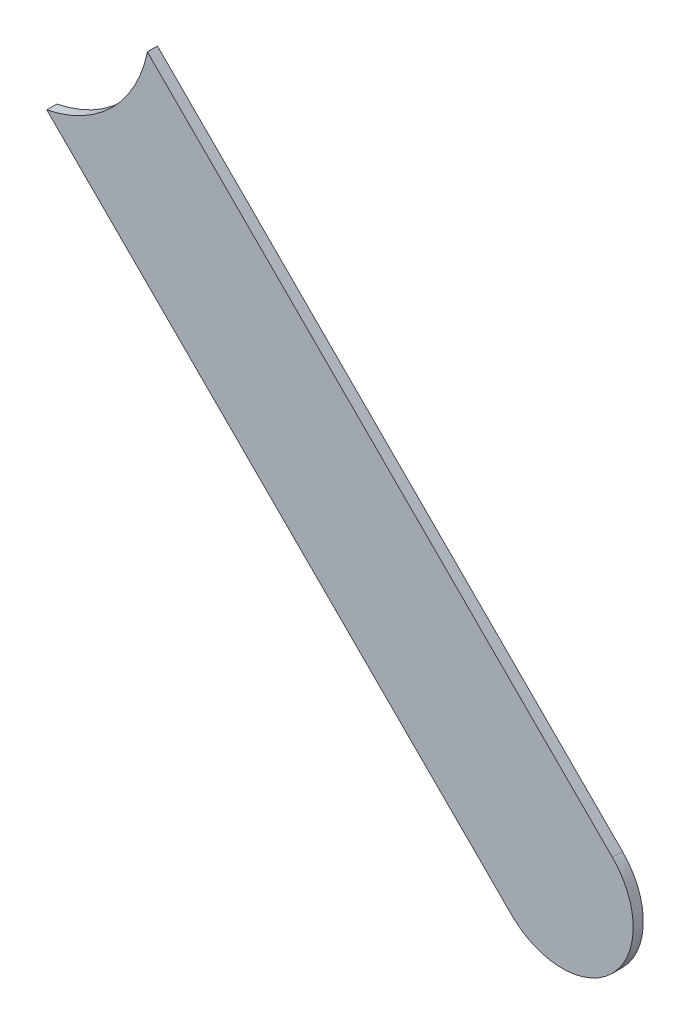
ISO-10303-21;
HEADER;
FILE_DESCRIPTION(('STEP AP214'),'2;1');
FILE_NAME('part.step','',(''),(''),'','','');
FILE_SCHEMA(('AUTOMOTIVE_DESIGN { 1 0 10303 214 1 1 1 1 }'));
ENDSEC;
DATA;
#1=APPLICATION_CONTEXT('core data for automotive mechanical design processes');
#2=APPLICATION_PROTOCOL_DEFINITION('international standard','automotive_design',2000,#1);
#3=PRODUCT_CONTEXT('',#1,'mechanical');
#4=PRODUCT('Part','Part','',(#3));
#5=PRODUCT_RELATED_PRODUCT_CATEGORY('part','',(#4));
#6=PRODUCT_DEFINITION_FORMATION('','',#4);
#7=PRODUCT_DEFINITION_CONTEXT('part definition',#1,'design');
#8=PRODUCT_DEFINITION('design','',#6,#7);
#9=PRODUCT_DEFINITION_SHAPE('','',#8);
#10=(LENGTH_UNIT() NAMED_UNIT(*) SI_UNIT(.MILLI.,.METRE.));
#11=(NAMED_UNIT(*) PLANE_ANGLE_UNIT() SI_UNIT($,.RADIAN.));
#12=(NAMED_UNIT(*) SI_UNIT($,.STERADIAN.) SOLID_ANGLE_UNIT());
#13=UNCERTAINTY_MEASURE_WITH_UNIT(LENGTH_MEASURE(1.E-05),#10,'distance_accuracy_value','');
#14=(GEOMETRIC_REPRESENTATION_CONTEXT(3) GLOBAL_UNCERTAINTY_ASSIGNED_CONTEXT((#13)) GLOBAL_UNIT_ASSIGNED_CONTEXT((#10,
#11,#12)) REPRESENTATION_CONTEXT('',''));
#15=CARTESIAN_POINT('',(0.,0.,0.));
#16=DIRECTION('',(0.,0.,1.));
#17=DIRECTION('',(1.,0.,0.));
#18=AXIS2_PLACEMENT_3D('',#15,#16,#17);
#19=CARTESIAN_POINT('',(46.0878077963948,73.1586542436052,0.));
#20=DIRECTION('',(0.707106781186548,0.707106781186548,0.));
#21=DIRECTION('',(0.707106781186548,-0.707106781186548,0.));
#22=AXIS2_PLACEMENT_3D('',#19,#20,#21);
#23=PLANE('',#22);
#24=DIRECTION('',(0.707106781186548,-0.707106781186548,0.));
#25=VECTOR('',#24,1.);
#26=CARTESIAN_POINT('',(45.82323322,73.42322882,0.03556));
#27=LINE('',#26,#25);
#28=CARTESIAN_POINT('',(46.0878077963948,73.1586542436052,0.03556));
#29=VERTEX_POINT('',#28);
#30=CARTESIAN_POINT('',(47.72322434,71.5232377,0.03556));
#31=VERTEX_POINT('',#30);
#32=EDGE_CURVE('E11',#29,#31,#27,.T.);
#33=ORIENTED_EDGE('',*,*,#32,.F.);
#34=DIRECTION('',(0.,0.,1.));
#35=VECTOR('',#34,1.);
#36=CARTESIAN_POINT('',(46.0878077963948,73.1586542436052,0.));
#37=LINE('',#36,#35);
#38=CARTESIAN_POINT('',(46.0878077963948,73.1586542436052,0.));
#39=VERTEX_POINT('',#38);
#40=EDGE_CURVE('E24',#39,#29,#37,.T.);
#41=ORIENTED_EDGE('',*,*,#40,.F.);
#42=DIRECTION('',(0.707106781186548,-0.707106781186548,0.));
#43=VECTOR('',#42,1.);
#44=CARTESIAN_POINT('',(45.82323322,73.42322882,0.));
#45=LINE('',#44,#43);
#46=CARTESIAN_POINT('',(47.72322434,71.5232377,0.));
#47=VERTEX_POINT('',#46);
#48=EDGE_CURVE('E75',#39,#47,#45,.T.);
#49=ORIENTED_EDGE('',*,*,#48,.T.);
#50=DIRECTION('',(0.,0.,1.));
#51=VECTOR('',#50,1.);
#52=CARTESIAN_POINT('',(47.72322434,71.5232377,0.));
#53=LINE('',#52,#51);
#54=EDGE_CURVE('E37',#47,#31,#53,.T.);
#55=ORIENTED_EDGE('',*,*,#54,.T.);
#56=EDGE_LOOP('',(#33,#41,#49,#55));
#57=FACE_BOUND('',#56,.T.);
#58=ADVANCED_FACE('F17',(#57),#23,.F.);
#59=CARTESIAN_POINT('',(47.90000072,71.70001408,0.));
#60=DIRECTION('',(0.,0.,-1.));
#61=DIRECTION('',(-0.707106781186562,-0.707106781186533,0.));
#62=AXIS2_PLACEMENT_3D('',#59,#60,#61);
#63=CYLINDRICAL_SURFACE('',#62,0.249999554103221);
#64=CARTESIAN_POINT('',(47.90000072,71.70001408,0.03556));
#65=DIRECTION('',(0.,0.,1.));
#66=DIRECTION('',(-0.707106781186562,-0.707106781186533,0.));
#67=AXIS2_PLACEMENT_3D('',#64,#65,#66);
#68=CIRCLE('',#67,0.249999554103221);
#69=CARTESIAN_POINT('',(48.0767771,71.87679046,0.03556));
#70=VERTEX_POINT('',#69);
#71=EDGE_CURVE('E83',#31,#70,#68,.T.);
#72=ORIENTED_EDGE('',*,*,#71,.F.);
#73=ORIENTED_EDGE('',*,*,#54,.F.);
#74=CARTESIAN_POINT('',(47.90000072,71.70001408,0.));
#75=DIRECTION('',(0.,0.,1.));
#76=DIRECTION('',(-0.707106781186562,-0.707106781186533,0.));
#77=AXIS2_PLACEMENT_3D('',#74,#75,#76);
#78=CIRCLE('',#77,0.249999554103221);
#79=CARTESIAN_POINT('',(48.0767771,71.87679046,0.));
#80=VERTEX_POINT('',#79);
#81=EDGE_CURVE('E81',#47,#80,#78,.T.);
#82=ORIENTED_EDGE('',*,*,#81,.T.);
#83=DIRECTION('',(0.,0.,1.));
#84=VECTOR('',#83,1.);
#85=CARTESIAN_POINT('',(48.0767771,71.87679046,0.));
#86=LINE('',#85,#84);
#87=EDGE_CURVE('E67',#80,#70,#86,.T.);
#88=ORIENTED_EDGE('',*,*,#87,.T.);
#89=EDGE_LOOP('',(#72,#73,#82,#88));
#90=FACE_BOUND('',#89,.T.);
#91=ADVANCED_FACE('F89',(#90),#63,.T.);
#92=CARTESIAN_POINT('',(48.0767771,71.87679046,0.));
#93=DIRECTION('',(-0.707106781186549,-0.707106781186546,0.));
#94=DIRECTION('',(-0.707106781186546,0.707106781186549,0.));
#95=AXIS2_PLACEMENT_3D('',#92,#93,#94);
#96=PLANE('',#95);
#97=DIRECTION('',(-0.707106781186546,0.707106781186549,0.));
#98=VECTOR('',#97,1.);
#99=CARTESIAN_POINT('',(48.0767771,71.87679046,0.03556));
#100=LINE('',#99,#98);
#101=CARTESIAN_POINT('',(46.4413605563948,73.5122070036052,0.03556));
#102=VERTEX_POINT('',#101);
#103=EDGE_CURVE('E71',#70,#102,#100,.T.);
#104=ORIENTED_EDGE('',*,*,#103,.F.);
#105=ORIENTED_EDGE('',*,*,#87,.F.);
#106=DIRECTION('',(-0.707106781186546,0.707106781186549,0.));
#107=VECTOR('',#106,1.);
#108=CARTESIAN_POINT('',(48.0767771,71.87679046,0.));
#109=LINE('',#108,#107);
#110=CARTESIAN_POINT('',(46.4413605563948,73.5122070036052,0.));
#111=VERTEX_POINT('',#110);
#112=EDGE_CURVE('E63',#80,#111,#109,.T.);
#113=ORIENTED_EDGE('',*,*,#112,.T.);
#114=DIRECTION('',(0.,0.,1.));
#115=VECTOR('',#114,1.);
#116=CARTESIAN_POINT('',(46.4413605563948,73.5122070036052,0.));
#117=LINE('',#116,#115);
#118=EDGE_CURVE('E53',#111,#102,#117,.T.);
#119=ORIENTED_EDGE('',*,*,#118,.T.);
#120=EDGE_LOOP('',(#104,#105,#113,#119));
#121=FACE_BOUND('',#120,.T.);
#122=ADVANCED_FACE('F66',(#121),#96,.F.);
#123=CARTESIAN_POINT('',(46.0000096,73.6000052,0.));
#124=DIRECTION('',(0.,0.,-1.));
#125=DIRECTION('',(1.,0.,0.));
#126=AXIS2_PLACEMENT_3D('',#123,#124,#125);
#127=CYLINDRICAL_SURFACE('',#126,0.4499991);
#128=ORIENTED_EDGE('',*,*,#40,.T.);
#129=CARTESIAN_POINT('',(46.0000096,73.6000052,0.03556));
#130=DIRECTION('',(0.,0.,1.));
#131=DIRECTION('',(1.,0.,0.));
#132=AXIS2_PLACEMENT_3D('',#129,#130,#131);
#133=CIRCLE('',#132,0.4499991);
#134=EDGE_CURVE('E59',#29,#102,#133,.T.);
#135=ORIENTED_EDGE('',*,*,#134,.T.);
#136=ORIENTED_EDGE('',*,*,#118,.F.);
#137=CARTESIAN_POINT('',(46.0000096,73.6000052,0.));
#138=DIRECTION('',(0.,0.,1.));
#139=DIRECTION('',(1.,0.,0.));
#140=AXIS2_PLACEMENT_3D('',#137,#138,#139);
#141=CIRCLE('',#140,0.4499991);
#142=EDGE_CURVE('E57',#39,#111,#141,.T.);
#143=ORIENTED_EDGE('',*,*,#142,.F.);
#144=EDGE_LOOP('',(#128,#135,#136,#143));
#145=FACE_BOUND('',#144,.T.);
#146=ADVANCED_FACE('F55',(#145),#127,.F.);
#147=CARTESIAN_POINT('',(45.82323322,73.42322882,0.));
#148=DIRECTION('',(0.,0.,-1.));
#149=DIRECTION('',(-1.,0.,0.));
#150=AXIS2_PLACEMENT_3D('',#147,#148,#149);
#151=PLANE('',#150);
#152=ORIENTED_EDGE('',*,*,#48,.F.);
#153=ORIENTED_EDGE('',*,*,#142,.T.);
#154=ORIENTED_EDGE('',*,*,#112,.F.);
#155=ORIENTED_EDGE('',*,*,#81,.F.);
#156=EDGE_LOOP('',(#152,#153,#154,#155));
#157=FACE_BOUND('',#156,.T.);
#158=ADVANCED_FACE('F74',(#157),#151,.T.);
#159=CARTESIAN_POINT('',(45.82323322,73.42322882,0.03556));
#160=DIRECTION('',(0.,0.,-1.));
#161=DIRECTION('',(-1.,0.,0.));
#162=AXIS2_PLACEMENT_3D('',#159,#160,#161);
#163=PLANE('',#162);
#164=ORIENTED_EDGE('',*,*,#134,.F.);
#165=ORIENTED_EDGE('',*,*,#32,.T.);
#166=ORIENTED_EDGE('',*,*,#71,.T.);
#167=ORIENTED_EDGE('',*,*,#103,.T.);
#168=EDGE_LOOP('',(#164,#165,#166,#167));
#169=FACE_BOUND('',#168,.T.);
#170=ADVANCED_FACE('F91',(#169),#163,.F.);
#171=CLOSED_SHELL('',(#58,#91,#122,#146,#158,#170));
#172=MANIFOLD_SOLID_BREP('B1',#171);
#173=ADVANCED_BREP_SHAPE_REPRESENTATION('',(#18,#172),#14);
#174=SHAPE_DEFINITION_REPRESENTATION(#9,#173);
ENDSEC;
END-ISO-10303-21;
